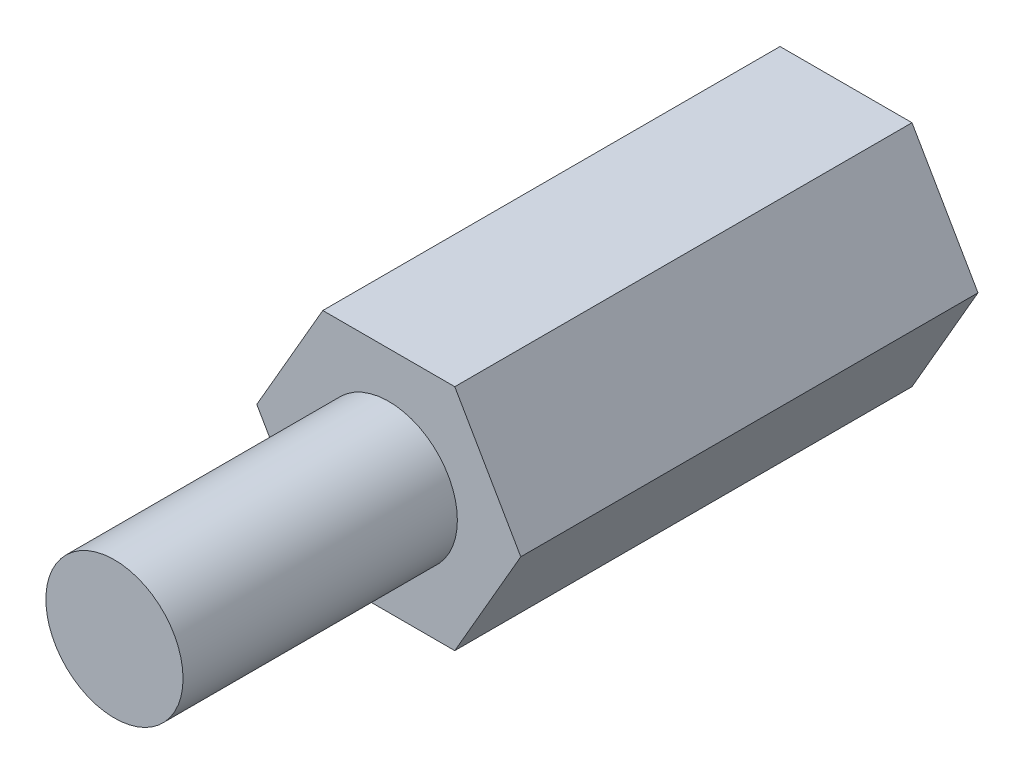
ISO-10303-21;
HEADER;
FILE_DESCRIPTION(('STEP AP214'),'2;1');
FILE_NAME('part.step','',(''),(''),'','','');
FILE_SCHEMA(('AUTOMOTIVE_DESIGN { 1 0 10303 214 1 1 1 1 }'));
ENDSEC;
DATA;
#1=APPLICATION_CONTEXT('core data for automotive mechanical design processes');
#2=APPLICATION_PROTOCOL_DEFINITION('international standard','automotive_design',2000,#1);
#3=PRODUCT_CONTEXT('',#1,'mechanical');
#4=PRODUCT('Part','Part','',(#3));
#5=PRODUCT_RELATED_PRODUCT_CATEGORY('part','',(#4));
#6=PRODUCT_DEFINITION_FORMATION('','',#4);
#7=PRODUCT_DEFINITION_CONTEXT('part definition',#1,'design');
#8=PRODUCT_DEFINITION('design','',#6,#7);
#9=PRODUCT_DEFINITION_SHAPE('','',#8);
#10=(LENGTH_UNIT() NAMED_UNIT(*) SI_UNIT(.MILLI.,.METRE.));
#11=(NAMED_UNIT(*) PLANE_ANGLE_UNIT() SI_UNIT($,.RADIAN.));
#12=(NAMED_UNIT(*) SI_UNIT($,.STERADIAN.) SOLID_ANGLE_UNIT());
#13=UNCERTAINTY_MEASURE_WITH_UNIT(LENGTH_MEASURE(1.E-05),#10,'distance_accuracy_value','');
#14=(GEOMETRIC_REPRESENTATION_CONTEXT(3) GLOBAL_UNCERTAINTY_ASSIGNED_CONTEXT((#13)) GLOBAL_UNIT_ASSIGNED_CONTEXT((#10,
#11,#12)) REPRESENTATION_CONTEXT('',''));
#15=CARTESIAN_POINT('',(0.,0.,0.));
#16=DIRECTION('',(0.,0.,1.));
#17=DIRECTION('',(1.,0.,0.));
#18=AXIS2_PLACEMENT_3D('',#15,#16,#17);
#19=CARTESIAN_POINT('',(0.,0.,0.));
#20=DIRECTION('',(0.,0.,1.));
#21=DIRECTION('',(1.,0.,0.));
#22=AXIS2_PLACEMENT_3D('',#19,#20,#21);
#23=PLANE('',#22);
#24=DIRECTION('',(-1.,0.,0.));
#25=VECTOR('',#24,1.);
#26=CARTESIAN_POINT('',(1.44337567297407,2.5,0.));
#27=LINE('',#26,#25);
#28=CARTESIAN_POINT('',(1.44337567297407,2.5,0.));
#29=VERTEX_POINT('',#28);
#30=CARTESIAN_POINT('',(-1.44337567297406,2.5,0.));
#31=VERTEX_POINT('',#30);
#32=EDGE_CURVE('E124',#29,#31,#27,.T.);
#33=ORIENTED_EDGE('',*,*,#32,.F.);
#34=DIRECTION('',(-0.5,0.866025403784439,0.));
#35=VECTOR('',#34,1.);
#36=CARTESIAN_POINT('',(2.88675134594813,0.,0.));
#37=LINE('',#36,#35);
#38=CARTESIAN_POINT('',(2.88675134594813,0.,0.));
#39=VERTEX_POINT('',#38);
#40=EDGE_CURVE('E83',#39,#29,#37,.T.);
#41=ORIENTED_EDGE('',*,*,#40,.F.);
#42=DIRECTION('',(0.5,0.866025403784439,0.));
#43=VECTOR('',#42,1.);
#44=CARTESIAN_POINT('',(1.44337567297406,-2.5,0.));
#45=LINE('',#44,#43);
#46=CARTESIAN_POINT('',(1.44337567297406,-2.5,0.));
#47=VERTEX_POINT('',#46);
#48=EDGE_CURVE('E77',#47,#39,#45,.T.);
#49=ORIENTED_EDGE('',*,*,#48,.F.);
#50=DIRECTION('',(1.,0.,0.));
#51=VECTOR('',#50,1.);
#52=CARTESIAN_POINT('',(-1.44337567297406,-2.5,0.));
#53=LINE('',#52,#51);
#54=CARTESIAN_POINT('',(-1.44337567297406,-2.5,0.));
#55=VERTEX_POINT('',#54);
#56=EDGE_CURVE('E114',#55,#47,#53,.T.);
#57=ORIENTED_EDGE('',*,*,#56,.F.);
#58=DIRECTION('',(0.5,-0.866025403784438,0.));
#59=VECTOR('',#58,1.);
#60=CARTESIAN_POINT('',(-2.88675134594813,0.,0.));
#61=LINE('',#60,#59);
#62=CARTESIAN_POINT('',(-2.88675134594813,0.,0.));
#63=VERTEX_POINT('',#62);
#64=EDGE_CURVE('E130',#63,#55,#61,.T.);
#65=ORIENTED_EDGE('',*,*,#64,.F.);
#66=DIRECTION('',(-0.5,-0.866025403784439,0.));
#67=VECTOR('',#66,1.);
#68=CARTESIAN_POINT('',(-1.44337567297406,2.5,0.));
#69=LINE('',#68,#67);
#70=EDGE_CURVE('E127',#31,#63,#69,.T.);
#71=ORIENTED_EDGE('',*,*,#70,.F.);
#72=EDGE_LOOP('',(#33,#41,#49,#57,#65,#71));
#73=FACE_BOUND('',#72,.T.);
#74=CARTESIAN_POINT('',(0.,0.,0.));
#75=DIRECTION('',(0.,0.,-1.));
#76=DIRECTION('',(-1.,0.,0.));
#77=AXIS2_PLACEMENT_3D('',#74,#75,#76);
#78=CIRCLE('',#77,1.24999999999999);
#79=CARTESIAN_POINT('',(-1.24999999999999,0.,0.));
#80=VERTEX_POINT('',#79);
#81=EDGE_CURVE('E185',#80,#80,#78,.T.);
#82=ORIENTED_EDGE('',*,*,#81,.F.);
#83=EDGE_LOOP('',(#82));
#84=FACE_BOUND('',#83,.T.);
#85=ADVANCED_FACE('F36',(#73,#84),#23,.F.);
#86=CARTESIAN_POINT('',(0.,0.,10.));
#87=DIRECTION('',(0.,0.,1.));
#88=DIRECTION('',(1.,0.,0.));
#89=AXIS2_PLACEMENT_3D('',#86,#87,#88);
#90=PLANE('',#89);
#91=DIRECTION('',(-1.,0.,0.));
#92=VECTOR('',#91,1.);
#93=CARTESIAN_POINT('',(1.44337567297407,2.5,10.));
#94=LINE('',#93,#92);
#95=CARTESIAN_POINT('',(1.44337567297407,2.5,10.));
#96=VERTEX_POINT('',#95);
#97=CARTESIAN_POINT('',(-1.44337567297406,2.5,10.));
#98=VERTEX_POINT('',#97);
#99=EDGE_CURVE('E135',#96,#98,#94,.T.);
#100=ORIENTED_EDGE('',*,*,#99,.T.);
#101=DIRECTION('',(-0.5,-0.866025403784439,0.));
#102=VECTOR('',#101,1.);
#103=CARTESIAN_POINT('',(-1.44337567297406,2.5,10.));
#104=LINE('',#103,#102);
#105=CARTESIAN_POINT('',(-2.88675134594813,0.,10.));
#106=VERTEX_POINT('',#105);
#107=EDGE_CURVE('E91',#98,#106,#104,.T.);
#108=ORIENTED_EDGE('',*,*,#107,.T.);
#109=DIRECTION('',(0.5,-0.866025403784438,0.));
#110=VECTOR('',#109,1.);
#111=CARTESIAN_POINT('',(-2.88675134594813,0.,10.));
#112=LINE('',#111,#110);
#113=CARTESIAN_POINT('',(-1.44337567297406,-2.5,10.));
#114=VERTEX_POINT('',#113);
#115=EDGE_CURVE('E106',#106,#114,#112,.T.);
#116=ORIENTED_EDGE('',*,*,#115,.T.);
#117=DIRECTION('',(1.,0.,0.));
#118=VECTOR('',#117,1.);
#119=CARTESIAN_POINT('',(-1.44337567297406,-2.5,10.));
#120=LINE('',#119,#118);
#121=CARTESIAN_POINT('',(1.44337567297406,-2.5,10.));
#122=VERTEX_POINT('',#121);
#123=EDGE_CURVE('E99',#114,#122,#120,.T.);
#124=ORIENTED_EDGE('',*,*,#123,.T.);
#125=DIRECTION('',(0.5,0.866025403784439,0.));
#126=VECTOR('',#125,1.);
#127=CARTESIAN_POINT('',(1.44337567297406,-2.5,10.));
#128=LINE('',#127,#126);
#129=CARTESIAN_POINT('',(2.88675134594813,0.,10.));
#130=VERTEX_POINT('',#129);
#131=EDGE_CURVE('E104',#122,#130,#128,.T.);
#132=ORIENTED_EDGE('',*,*,#131,.T.);
#133=DIRECTION('',(-0.5,0.866025403784439,0.));
#134=VECTOR('',#133,1.);
#135=CARTESIAN_POINT('',(2.88675134594813,0.,10.));
#136=LINE('',#135,#134);
#137=EDGE_CURVE('E53',#130,#96,#136,.T.);
#138=ORIENTED_EDGE('',*,*,#137,.T.);
#139=EDGE_LOOP('',(#100,#108,#116,#124,#132,#138));
#140=FACE_BOUND('',#139,.T.);
#141=CARTESIAN_POINT('',(0.,0.,10.));
#142=DIRECTION('',(0.,0.,1.));
#143=DIRECTION('',(1.,0.,0.));
#144=AXIS2_PLACEMENT_3D('',#141,#142,#143);
#145=CIRCLE('',#144,1.5);
#146=CARTESIAN_POINT('',(1.5,0.,10.));
#147=VERTEX_POINT('',#146);
#148=EDGE_CURVE('E187',#147,#147,#145,.T.);
#149=ORIENTED_EDGE('',*,*,#148,.F.);
#150=EDGE_LOOP('',(#149));
#151=FACE_BOUND('',#150,.T.);
#152=ADVANCED_FACE('F101',(#140,#151),#90,.T.);
#153=CARTESIAN_POINT('',(1.44337567297407,2.5,10.));
#154=DIRECTION('',(0.,-1.,0.));
#155=DIRECTION('',(0.,0.,-1.));
#156=AXIS2_PLACEMENT_3D('',#153,#154,#155);
#157=PLANE('',#156);
#158=ORIENTED_EDGE('',*,*,#32,.T.);
#159=DIRECTION('',(0.,0.,-1.));
#160=VECTOR('',#159,1.);
#161=CARTESIAN_POINT('',(-1.44337567297406,2.5,10.));
#162=LINE('',#161,#160);
#163=EDGE_CURVE('E11',#98,#31,#162,.T.);
#164=ORIENTED_EDGE('',*,*,#163,.F.);
#165=ORIENTED_EDGE('',*,*,#99,.F.);
#166=DIRECTION('',(0.,0.,-1.));
#167=VECTOR('',#166,1.);
#168=CARTESIAN_POINT('',(1.44337567297407,2.5,10.));
#169=LINE('',#168,#167);
#170=EDGE_CURVE('E120',#96,#29,#169,.T.);
#171=ORIENTED_EDGE('',*,*,#170,.T.);
#172=EDGE_LOOP('',(#158,#164,#165,#171));
#173=FACE_BOUND('',#172,.T.);
#174=ADVANCED_FACE('F38',(#173),#157,.F.);
#175=CARTESIAN_POINT('',(-1.44337567297406,2.5,10.));
#176=DIRECTION('',(0.866025403784439,-0.5,0.));
#177=DIRECTION('',(0.5,0.866025403784439,0.));
#178=AXIS2_PLACEMENT_3D('',#175,#176,#177);
#179=PLANE('',#178);
#180=ORIENTED_EDGE('',*,*,#70,.T.);
#181=DIRECTION('',(0.,0.,-1.));
#182=VECTOR('',#181,1.);
#183=CARTESIAN_POINT('',(-2.88675134594813,0.,10.));
#184=LINE('',#183,#182);
#185=EDGE_CURVE('E45',#106,#63,#184,.T.);
#186=ORIENTED_EDGE('',*,*,#185,.F.);
#187=ORIENTED_EDGE('',*,*,#107,.F.);
#188=ORIENTED_EDGE('',*,*,#163,.T.);
#189=EDGE_LOOP('',(#180,#186,#187,#188));
#190=FACE_BOUND('',#189,.T.);
#191=ADVANCED_FACE('F247',(#190),#179,.F.);
#192=CARTESIAN_POINT('',(-2.88675134594813,0.,10.));
#193=DIRECTION('',(0.866025403784438,0.5,0.));
#194=DIRECTION('',(-0.5,0.866025403784438,0.));
#195=AXIS2_PLACEMENT_3D('',#192,#193,#194);
#196=PLANE('',#195);
#197=ORIENTED_EDGE('',*,*,#64,.T.);
#198=DIRECTION('',(0.,0.,-1.));
#199=VECTOR('',#198,1.);
#200=CARTESIAN_POINT('',(-1.44337567297406,-2.5,10.));
#201=LINE('',#200,#199);
#202=EDGE_CURVE('E115',#114,#55,#201,.T.);
#203=ORIENTED_EDGE('',*,*,#202,.F.);
#204=ORIENTED_EDGE('',*,*,#115,.F.);
#205=ORIENTED_EDGE('',*,*,#185,.T.);
#206=EDGE_LOOP('',(#197,#203,#204,#205));
#207=FACE_BOUND('',#206,.T.);
#208=ADVANCED_FACE('F141',(#207),#196,.F.);
#209=CARTESIAN_POINT('',(-1.44337567297406,-2.5,10.));
#210=DIRECTION('',(0.,1.,0.));
#211=DIRECTION('',(-1.,0.,0.));
#212=AXIS2_PLACEMENT_3D('',#209,#210,#211);
#213=PLANE('',#212);
#214=ORIENTED_EDGE('',*,*,#56,.T.);
#215=DIRECTION('',(0.,0.,-1.));
#216=VECTOR('',#215,1.);
#217=CARTESIAN_POINT('',(1.44337567297406,-2.5,10.));
#218=LINE('',#217,#216);
#219=EDGE_CURVE('E111',#122,#47,#218,.T.);
#220=ORIENTED_EDGE('',*,*,#219,.F.);
#221=ORIENTED_EDGE('',*,*,#123,.F.);
#222=ORIENTED_EDGE('',*,*,#202,.T.);
#223=EDGE_LOOP('',(#214,#220,#221,#222));
#224=FACE_BOUND('',#223,.T.);
#225=ADVANCED_FACE('F112',(#224),#213,.F.);
#226=CARTESIAN_POINT('',(1.44337567297406,-2.5,10.));
#227=DIRECTION('',(-0.866025403784439,0.5,0.));
#228=DIRECTION('',(-0.5,-0.866025403784439,0.));
#229=AXIS2_PLACEMENT_3D('',#226,#227,#228);
#230=PLANE('',#229);
#231=ORIENTED_EDGE('',*,*,#48,.T.);
#232=DIRECTION('',(0.,0.,-1.));
#233=VECTOR('',#232,1.);
#234=CARTESIAN_POINT('',(2.88675134594813,0.,10.));
#235=LINE('',#234,#233);
#236=EDGE_CURVE('E116',#130,#39,#235,.T.);
#237=ORIENTED_EDGE('',*,*,#236,.F.);
#238=ORIENTED_EDGE('',*,*,#131,.F.);
#239=ORIENTED_EDGE('',*,*,#219,.T.);
#240=EDGE_LOOP('',(#231,#237,#238,#239));
#241=FACE_BOUND('',#240,.T.);
#242=ADVANCED_FACE('F118',(#241),#230,.F.);
#243=CARTESIAN_POINT('',(2.88675134594813,0.,10.));
#244=DIRECTION('',(-0.866025403784439,-0.5,0.));
#245=DIRECTION('',(0.5,-0.866025403784439,0.));
#246=AXIS2_PLACEMENT_3D('',#243,#244,#245);
#247=PLANE('',#246);
#248=ORIENTED_EDGE('',*,*,#40,.T.);
#249=ORIENTED_EDGE('',*,*,#170,.F.);
#250=ORIENTED_EDGE('',*,*,#137,.F.);
#251=ORIENTED_EDGE('',*,*,#236,.T.);
#252=EDGE_LOOP('',(#248,#249,#250,#251));
#253=FACE_BOUND('',#252,.T.);
#254=ADVANCED_FACE('F148',(#253),#247,.F.);
#255=CARTESIAN_POINT('',(0.,0.,16.));
#256=DIRECTION('',(0.,0.,-1.));
#257=DIRECTION('',(-1.,0.,0.));
#258=AXIS2_PLACEMENT_3D('',#255,#256,#257);
#259=CYLINDRICAL_SURFACE('',#258,1.5);
#260=CARTESIAN_POINT('',(0.,0.,16.));
#261=DIRECTION('',(0.,0.,1.));
#262=DIRECTION('',(1.,0.,0.));
#263=AXIS2_PLACEMENT_3D('',#260,#261,#262);
#264=CIRCLE('',#263,1.5);
#265=CARTESIAN_POINT('',(1.5,0.,16.));
#266=VERTEX_POINT('',#265);
#267=EDGE_CURVE('E128',#266,#266,#264,.T.);
#268=ORIENTED_EDGE('',*,*,#267,.F.);
#269=EDGE_LOOP('',(#268));
#270=FACE_BOUND('',#269,.T.);
#271=ORIENTED_EDGE('',*,*,#148,.T.);
#272=EDGE_LOOP('',(#271));
#273=FACE_BOUND('',#272,.T.);
#274=ADVANCED_FACE('F150',(#270,#273),#259,.T.);
#275=CARTESIAN_POINT('',(0.,0.,16.));
#276=DIRECTION('',(0.,0.,1.));
#277=DIRECTION('',(1.,0.,0.));
#278=AXIS2_PLACEMENT_3D('',#275,#276,#277);
#279=PLANE('',#278);
#280=ORIENTED_EDGE('',*,*,#267,.T.);
#281=EDGE_LOOP('',(#280));
#282=FACE_BOUND('',#281,.T.);
#283=ADVANCED_FACE('F156',(#282),#279,.T.);
#284=CARTESIAN_POINT('',(0.,0.,8.));
#285=DIRECTION('',(0.,0.,-1.));
#286=DIRECTION('',(-1.,0.,0.));
#287=AXIS2_PLACEMENT_3D('',#284,#285,#286);
#288=CONICAL_SURFACE('',#287,1.25,1.02974425867665);
#289=CARTESIAN_POINT('',(0.,0.,8.75107577378445));
#290=VERTEX_POINT('',#289);
#291=VERTEX_LOOP('',#290);
#292=FACE_BOUND('',#291,.T.);
#293=CARTESIAN_POINT('',(0.,0.,8.));
#294=DIRECTION('',(0.,0.,-1.));
#295=DIRECTION('',(-1.,0.,0.));
#296=AXIS2_PLACEMENT_3D('',#293,#294,#295);
#297=CIRCLE('',#296,1.25);
#298=CARTESIAN_POINT('',(-1.25,0.,8.));
#299=VERTEX_POINT('',#298);
#300=EDGE_CURVE('E182',#299,#299,#297,.T.);
#301=ORIENTED_EDGE('',*,*,#300,.T.);
#302=EDGE_LOOP('',(#301));
#303=FACE_BOUND('',#302,.T.);
#304=ADVANCED_FACE('F169',(#292,#303),#288,.F.);
#305=CARTESIAN_POINT('',(0.,0.,0.));
#306=DIRECTION('',(0.,0.,-1.));
#307=DIRECTION('',(-1.,0.,0.));
#308=AXIS2_PLACEMENT_3D('',#305,#306,#307);
#309=CYLINDRICAL_SURFACE('',#308,1.24999999999999);
#310=ORIENTED_EDGE('',*,*,#300,.F.);
#311=EDGE_LOOP('',(#310));
#312=FACE_BOUND('',#311,.T.);
#313=ORIENTED_EDGE('',*,*,#81,.T.);
#314=EDGE_LOOP('',(#313));
#315=FACE_BOUND('',#314,.T.);
#316=ADVANCED_FACE('F173',(#312,#315),#309,.F.);
#317=CLOSED_SHELL('',(#85,#152,#174,#191,#208,#225,#242,#254,#274,#283,#304,#316));
#318=MANIFOLD_SOLID_BREP('B2',#317);
#319=ADVANCED_BREP_SHAPE_REPRESENTATION('',(#18,#318),#14);
#320=SHAPE_DEFINITION_REPRESENTATION(#9,#319);
ENDSEC;
END-ISO-10303-21;
